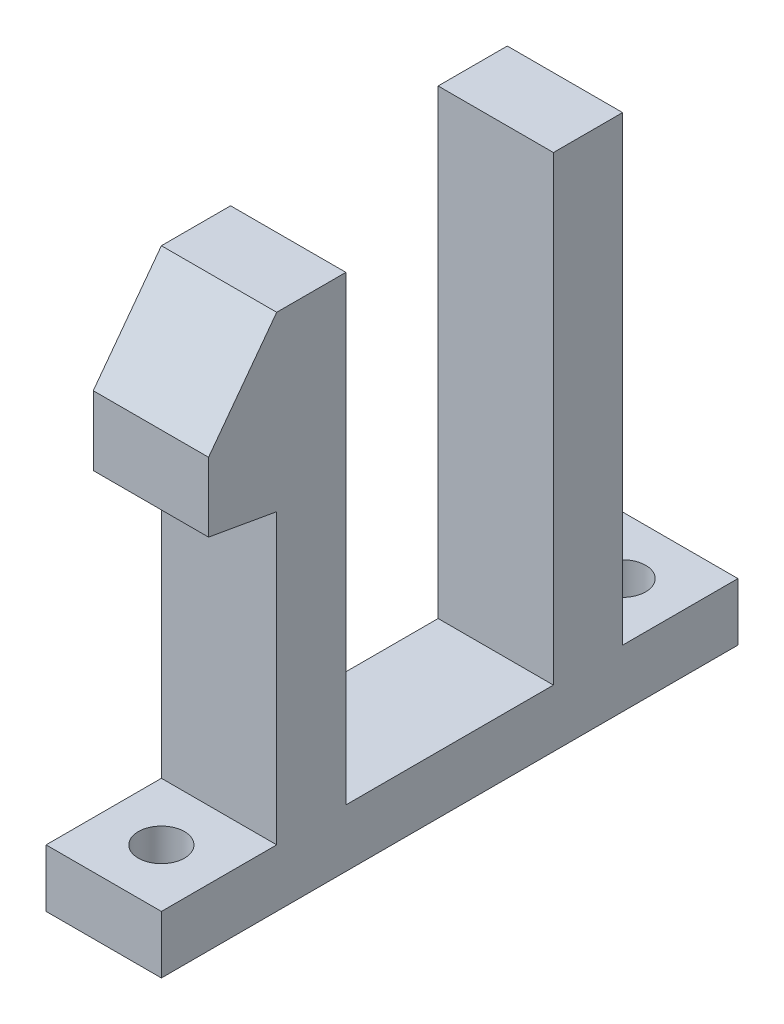
ISO-10303-21;
HEADER;
FILE_DESCRIPTION(('STEP AP214'),'2;1');
FILE_NAME('part.step','',(''),(''),'','','');
FILE_SCHEMA(('AUTOMOTIVE_DESIGN { 1 0 10303 214 1 1 1 1 }'));
ENDSEC;
DATA;
#1=APPLICATION_CONTEXT('core data for automotive mechanical design processes');
#2=APPLICATION_PROTOCOL_DEFINITION('international standard','automotive_design',2000,#1);
#3=PRODUCT_CONTEXT('',#1,'mechanical');
#4=PRODUCT('Part','Part','',(#3));
#5=PRODUCT_RELATED_PRODUCT_CATEGORY('part','',(#4));
#6=PRODUCT_DEFINITION_FORMATION('','',#4);
#7=PRODUCT_DEFINITION_CONTEXT('part definition',#1,'design');
#8=PRODUCT_DEFINITION('design','',#6,#7);
#9=PRODUCT_DEFINITION_SHAPE('','',#8);
#10=(LENGTH_UNIT() NAMED_UNIT(*) SI_UNIT(.MILLI.,.METRE.));
#11=(NAMED_UNIT(*) PLANE_ANGLE_UNIT() SI_UNIT($,.RADIAN.));
#12=(NAMED_UNIT(*) SI_UNIT($,.STERADIAN.) SOLID_ANGLE_UNIT());
#13=UNCERTAINTY_MEASURE_WITH_UNIT(LENGTH_MEASURE(1.E-05),#10,'distance_accuracy_value','');
#14=(GEOMETRIC_REPRESENTATION_CONTEXT(3) GLOBAL_UNCERTAINTY_ASSIGNED_CONTEXT((#13)) GLOBAL_UNIT_ASSIGNED_CONTEXT((#10,
#11,#12)) REPRESENTATION_CONTEXT('',''));
#15=CARTESIAN_POINT('',(0.,0.,0.));
#16=DIRECTION('',(0.,0.,1.));
#17=DIRECTION('',(1.,0.,0.));
#18=AXIS2_PLACEMENT_3D('',#15,#16,#17);
#19=CARTESIAN_POINT('',(0.,22.5,0.));
#20=DIRECTION('',(0.,1.,0.));
#21=DIRECTION('',(0.,0.,1.));
#22=AXIS2_PLACEMENT_3D('',#19,#20,#21);
#23=PLANE('',#22);
#24=DIRECTION('',(1.,0.,0.));
#25=VECTOR('',#24,1.);
#26=CARTESIAN_POINT('',(-2.5,22.5,4.5));
#27=LINE('',#26,#25);
#28=CARTESIAN_POINT('',(-2.5,22.5,4.5));
#29=VERTEX_POINT('',#28);
#30=CARTESIAN_POINT('',(2.5,22.5,4.5));
#31=VERTEX_POINT('',#30);
#32=EDGE_CURVE('E173',#29,#31,#27,.T.);
#33=ORIENTED_EDGE('',*,*,#32,.F.);
#34=DIRECTION('',(0.,0.,1.));
#35=VECTOR('',#34,1.);
#36=CARTESIAN_POINT('',(-2.5,22.5,-7.5));
#37=LINE('',#36,#35);
#38=CARTESIAN_POINT('',(-2.5,22.5,7.5));
#39=VERTEX_POINT('',#38);
#40=EDGE_CURVE('E167',#29,#39,#37,.T.);
#41=ORIENTED_EDGE('',*,*,#40,.T.);
#42=DIRECTION('',(1.,0.,0.));
#43=VECTOR('',#42,1.);
#44=CARTESIAN_POINT('',(-2.5,22.5,7.5));
#45=LINE('',#44,#43);
#46=CARTESIAN_POINT('',(2.5,22.5,7.5));
#47=VERTEX_POINT('',#46);
#48=EDGE_CURVE('E149',#39,#47,#45,.T.);
#49=ORIENTED_EDGE('',*,*,#48,.T.);
#50=DIRECTION('',(0.,0.,-1.));
#51=VECTOR('',#50,1.);
#52=CARTESIAN_POINT('',(2.5,22.5,-7.5));
#53=LINE('',#52,#51);
#54=EDGE_CURVE('E177',#47,#31,#53,.T.);
#55=ORIENTED_EDGE('',*,*,#54,.T.);
#56=EDGE_LOOP('',(#33,#41,#49,#55));
#57=FACE_BOUND('',#56,.T.);
#58=ADVANCED_FACE('F41',(#57),#23,.T.);
#59=CARTESIAN_POINT('',(0.,2.5,0.));
#60=DIRECTION('',(0.,1.,0.));
#61=DIRECTION('',(0.,0.,1.));
#62=AXIS2_PLACEMENT_3D('',#59,#60,#61);
#63=PLANE('',#62);
#64=DIRECTION('',(1.,0.,0.));
#65=VECTOR('',#64,1.);
#66=CARTESIAN_POINT('',(-2.5,2.5,7.5));
#67=LINE('',#66,#65);
#68=CARTESIAN_POINT('',(-2.5,2.5,7.5));
#69=VERTEX_POINT('',#68);
#70=CARTESIAN_POINT('',(2.5,2.5,7.5));
#71=VERTEX_POINT('',#70);
#72=EDGE_CURVE('E184',#69,#71,#67,.T.);
#73=ORIENTED_EDGE('',*,*,#72,.F.);
#74=DIRECTION('',(0.,0.,1.));
#75=VECTOR('',#74,1.);
#76=CARTESIAN_POINT('',(-2.5,2.5,-12.5));
#77=LINE('',#76,#75);
#78=CARTESIAN_POINT('',(-2.5,2.5,12.5));
#79=VERTEX_POINT('',#78);
#80=EDGE_CURVE('E216',#69,#79,#77,.T.);
#81=ORIENTED_EDGE('',*,*,#80,.T.);
#82=DIRECTION('',(1.,0.,0.));
#83=VECTOR('',#82,1.);
#84=CARTESIAN_POINT('',(-2.5,2.5,12.5));
#85=LINE('',#84,#83);
#86=CARTESIAN_POINT('',(2.5,2.5,12.5));
#87=VERTEX_POINT('',#86);
#88=EDGE_CURVE('E219',#79,#87,#85,.T.);
#89=ORIENTED_EDGE('',*,*,#88,.T.);
#90=DIRECTION('',(0.,0.,-1.));
#91=VECTOR('',#90,1.);
#92=CARTESIAN_POINT('',(2.5,2.5,-12.5));
#93=LINE('',#92,#91);
#94=EDGE_CURVE('E210',#87,#71,#93,.T.);
#95=ORIENTED_EDGE('',*,*,#94,.T.);
#96=EDGE_LOOP('',(#73,#81,#89,#95));
#97=FACE_BOUND('',#96,.T.);
#98=CARTESIAN_POINT('',(0.,2.5,10.));
#99=DIRECTION('',(0.,1.,0.));
#100=DIRECTION('',(0.,0.,-1.));
#101=AXIS2_PLACEMENT_3D('',#98,#99,#100);
#102=CIRCLE('',#101,1.);
#103=CARTESIAN_POINT('',(0.,2.5,9.));
#104=VERTEX_POINT('',#103);
#105=EDGE_CURVE('E198',#104,#104,#102,.T.);
#106=ORIENTED_EDGE('',*,*,#105,.F.);
#107=EDGE_LOOP('',(#106));
#108=FACE_BOUND('',#107,.T.);
#109=ADVANCED_FACE('F256',(#97,#108),#63,.T.);
#110=DIRECTION('',(-1.,0.,0.));
#111=VECTOR('',#110,1.);
#112=CARTESIAN_POINT('',(-2.5,2.5,-7.5));
#113=LINE('',#112,#111);
#114=CARTESIAN_POINT('',(2.5,2.5,-7.5));
#115=VERTEX_POINT('',#114);
#116=CARTESIAN_POINT('',(-2.5,2.5,-7.5));
#117=VERTEX_POINT('',#116);
#118=EDGE_CURVE('E181',#115,#117,#113,.T.);
#119=ORIENTED_EDGE('',*,*,#118,.F.);
#120=CARTESIAN_POINT('',(2.5,2.5,-12.5));
#121=VERTEX_POINT('',#120);
#122=EDGE_CURVE('E214',#115,#121,#93,.T.);
#123=ORIENTED_EDGE('',*,*,#122,.T.);
#124=DIRECTION('',(-1.,0.,0.));
#125=VECTOR('',#124,1.);
#126=CARTESIAN_POINT('',(-2.5,2.5,-12.5));
#127=LINE('',#126,#125);
#128=CARTESIAN_POINT('',(-2.5,2.5,-12.5));
#129=VERTEX_POINT('',#128);
#130=EDGE_CURVE('E213',#121,#129,#127,.T.);
#131=ORIENTED_EDGE('',*,*,#130,.T.);
#132=EDGE_CURVE('E217',#129,#117,#77,.T.);
#133=ORIENTED_EDGE('',*,*,#132,.T.);
#134=EDGE_LOOP('',(#119,#123,#131,#133));
#135=FACE_BOUND('',#134,.T.);
#136=CARTESIAN_POINT('',(0.,2.5,-10.));
#137=DIRECTION('',(0.,1.,0.));
#138=DIRECTION('',(0.,0.,1.));
#139=AXIS2_PLACEMENT_3D('',#136,#137,#138);
#140=CIRCLE('',#139,1.);
#141=CARTESIAN_POINT('',(0.,2.5,-9.));
#142=VERTEX_POINT('',#141);
#143=EDGE_CURVE('E204',#142,#142,#140,.T.);
#144=ORIENTED_EDGE('',*,*,#143,.F.);
#145=EDGE_LOOP('',(#144));
#146=FACE_BOUND('',#145,.T.);
#147=ADVANCED_FACE('F310',(#135,#146),#63,.T.);
#148=CARTESIAN_POINT('',(0.,0.,0.));
#149=DIRECTION('',(0.,1.,0.));
#150=DIRECTION('',(0.,0.,1.));
#151=AXIS2_PLACEMENT_3D('',#148,#149,#150);
#152=PLANE('',#151);
#153=DIRECTION('',(0.,0.,-1.));
#154=VECTOR('',#153,1.);
#155=CARTESIAN_POINT('',(2.5,0.,-12.5));
#156=LINE('',#155,#154);
#157=CARTESIAN_POINT('',(2.5,0.,12.5));
#158=VERTEX_POINT('',#157);
#159=CARTESIAN_POINT('',(2.5,0.,-12.5));
#160=VERTEX_POINT('',#159);
#161=EDGE_CURVE('E207',#158,#160,#156,.T.);
#162=ORIENTED_EDGE('',*,*,#161,.F.);
#163=DIRECTION('',(1.,0.,0.));
#164=VECTOR('',#163,1.);
#165=CARTESIAN_POINT('',(-2.5,0.,12.5));
#166=LINE('',#165,#164);
#167=CARTESIAN_POINT('',(-2.5,0.,12.5));
#168=VERTEX_POINT('',#167);
#169=EDGE_CURVE('E228',#168,#158,#166,.T.);
#170=ORIENTED_EDGE('',*,*,#169,.F.);
#171=DIRECTION('',(0.,0.,1.));
#172=VECTOR('',#171,1.);
#173=CARTESIAN_POINT('',(-2.5,0.,-12.5));
#174=LINE('',#173,#172);
#175=CARTESIAN_POINT('',(-2.5,0.,-12.5));
#176=VERTEX_POINT('',#175);
#177=EDGE_CURVE('E226',#176,#168,#174,.T.);
#178=ORIENTED_EDGE('',*,*,#177,.F.);
#179=DIRECTION('',(-1.,0.,0.));
#180=VECTOR('',#179,1.);
#181=CARTESIAN_POINT('',(-2.5,0.,-12.5));
#182=LINE('',#181,#180);
#183=EDGE_CURVE('E224',#160,#176,#182,.T.);
#184=ORIENTED_EDGE('',*,*,#183,.F.);
#185=EDGE_LOOP('',(#162,#170,#178,#184));
#186=FACE_BOUND('',#185,.T.);
#187=CARTESIAN_POINT('',(0.,0.,-10.));
#188=DIRECTION('',(0.,1.,0.));
#189=DIRECTION('',(0.,0.,1.));
#190=AXIS2_PLACEMENT_3D('',#187,#188,#189);
#191=CIRCLE('',#190,1.);
#192=CARTESIAN_POINT('',(0.,0.,-9.));
#193=VERTEX_POINT('',#192);
#194=EDGE_CURVE('E201',#193,#193,#191,.T.);
#195=ORIENTED_EDGE('',*,*,#194,.T.);
#196=EDGE_LOOP('',(#195));
#197=FACE_BOUND('',#196,.T.);
#198=CARTESIAN_POINT('',(0.,0.,10.));
#199=DIRECTION('',(0.,1.,0.));
#200=DIRECTION('',(0.,0.,-1.));
#201=AXIS2_PLACEMENT_3D('',#198,#199,#200);
#202=CIRCLE('',#201,1.);
#203=CARTESIAN_POINT('',(0.,0.,9.));
#204=VERTEX_POINT('',#203);
#205=EDGE_CURVE('E197',#204,#204,#202,.T.);
#206=ORIENTED_EDGE('',*,*,#205,.T.);
#207=EDGE_LOOP('',(#206));
#208=FACE_BOUND('',#207,.T.);
#209=ADVANCED_FACE('F244',(#186,#197,#208),#152,.F.);
#210=CARTESIAN_POINT('',(2.5,2.5,-12.5));
#211=DIRECTION('',(-1.,0.,0.));
#212=DIRECTION('',(0.,0.,1.));
#213=AXIS2_PLACEMENT_3D('',#210,#211,#212);
#214=PLANE('',#213);
#215=DIRECTION('',(0.,0.,-1.));
#216=VECTOR('',#215,1.);
#217=CARTESIAN_POINT('',(2.5,2.49999999999998,4.5));
#218=LINE('',#217,#216);
#219=CARTESIAN_POINT('',(2.5,2.49999999999998,4.5));
#220=VERTEX_POINT('',#219);
#221=CARTESIAN_POINT('',(2.5,2.49999999999998,-4.5));
#222=VERTEX_POINT('',#221);
#223=EDGE_CURVE('E290',#220,#222,#218,.T.);
#224=ORIENTED_EDGE('',*,*,#223,.F.);
#225=DIRECTION('',(0.,-1.,0.));
#226=VECTOR('',#225,1.);
#227=CARTESIAN_POINT('',(2.5,22.5,4.5));
#228=LINE('',#227,#226);
#229=EDGE_CURVE('E277',#31,#220,#228,.T.);
#230=ORIENTED_EDGE('',*,*,#229,.F.);
#231=ORIENTED_EDGE('',*,*,#54,.F.);
#232=DIRECTION('',(0.,-0.802022675244056,0.597293586433312));
#233=VECTOR('',#232,1.);
#234=CARTESIAN_POINT('',(2.5,18.5329149687256,10.4544232590366));
#235=LINE('',#234,#233);
#236=CARTESIAN_POINT('',(2.5,18.5329149687256,10.4544232590366));
#237=VERTEX_POINT('',#236);
#238=EDGE_CURVE('E154',#47,#237,#235,.T.);
#239=ORIENTED_EDGE('',*,*,#238,.T.);
#240=DIRECTION('',(0.,-1.,0.));
#241=VECTOR('',#240,1.);
#242=CARTESIAN_POINT('',(2.5,15.5329149687256,10.4544232590366));
#243=LINE('',#242,#241);
#244=CARTESIAN_POINT('',(2.5,15.5329149687256,10.4544232590366));
#245=VERTEX_POINT('',#244);
#246=EDGE_CURVE('E273',#237,#245,#243,.T.);
#247=ORIENTED_EDGE('',*,*,#246,.T.);
#248=DIRECTION('',(0.,-0.173648177666934,-0.984807753012207));
#249=VECTOR('',#248,1.);
#250=CARTESIAN_POINT('',(2.5,15.0119704357248,7.5));
#251=LINE('',#250,#249);
#252=CARTESIAN_POINT('',(2.5,15.0119704357248,7.5));
#253=VERTEX_POINT('',#252);
#254=EDGE_CURVE('E56',#245,#253,#251,.T.);
#255=ORIENTED_EDGE('',*,*,#254,.T.);
#256=DIRECTION('',(0.,-1.,0.));
#257=VECTOR('',#256,1.);
#258=CARTESIAN_POINT('',(2.5,22.5,7.5));
#259=LINE('',#258,#257);
#260=EDGE_CURVE('E159',#253,#71,#259,.T.);
#261=ORIENTED_EDGE('',*,*,#260,.T.);
#262=ORIENTED_EDGE('',*,*,#94,.F.);
#263=DIRECTION('',(0.,-1.,0.));
#264=VECTOR('',#263,1.);
#265=CARTESIAN_POINT('',(2.5,2.5,12.5));
#266=LINE('',#265,#264);
#267=EDGE_CURVE('E221',#87,#158,#266,.T.);
#268=ORIENTED_EDGE('',*,*,#267,.T.);
#269=ORIENTED_EDGE('',*,*,#161,.T.);
#270=DIRECTION('',(0.,-1.,0.));
#271=VECTOR('',#270,1.);
#272=CARTESIAN_POINT('',(2.5,2.5,-12.5));
#273=LINE('',#272,#271);
#274=EDGE_CURVE('E11',#121,#160,#273,.T.);
#275=ORIENTED_EDGE('',*,*,#274,.F.);
#276=ORIENTED_EDGE('',*,*,#122,.F.);
#277=DIRECTION('',(0.,-1.,0.));
#278=VECTOR('',#277,1.);
#279=CARTESIAN_POINT('',(2.5,22.5,-7.5));
#280=LINE('',#279,#278);
#281=CARTESIAN_POINT('',(2.5,22.5,-7.5));
#282=VERTEX_POINT('',#281);
#283=EDGE_CURVE('E194',#282,#115,#280,.T.);
#284=ORIENTED_EDGE('',*,*,#283,.F.);
#285=CARTESIAN_POINT('',(2.5,22.5,-4.5));
#286=VERTEX_POINT('',#285);
#287=EDGE_CURVE('E187',#286,#282,#53,.T.);
#288=ORIENTED_EDGE('',*,*,#287,.F.);
#289=DIRECTION('',(0.,1.,0.));
#290=VECTOR('',#289,1.);
#291=CARTESIAN_POINT('',(2.5,22.5,-4.5));
#292=LINE('',#291,#290);
#293=EDGE_CURVE('E64',#222,#286,#292,.T.);
#294=ORIENTED_EDGE('',*,*,#293,.F.);
#295=EDGE_LOOP('',(#224,#230,#231,#239,#247,#255,#261,#262,#268,#269,#275,#276,#284,#288,#294));
#296=FACE_BOUND('',#295,.T.);
#297=ADVANCED_FACE('F43',(#296),#214,.F.);
#298=CARTESIAN_POINT('',(-2.5,2.5,-12.5));
#299=DIRECTION('',(0.,0.,1.));
#300=DIRECTION('',(1.,0.,0.));
#301=AXIS2_PLACEMENT_3D('',#298,#299,#300);
#302=PLANE('',#301);
#303=ORIENTED_EDGE('',*,*,#183,.T.);
#304=DIRECTION('',(0.,-1.,0.));
#305=VECTOR('',#304,1.);
#306=CARTESIAN_POINT('',(-2.5,2.5,-12.5));
#307=LINE('',#306,#305);
#308=EDGE_CURVE('E49',#129,#176,#307,.T.);
#309=ORIENTED_EDGE('',*,*,#308,.F.);
#310=ORIENTED_EDGE('',*,*,#130,.F.);
#311=ORIENTED_EDGE('',*,*,#274,.T.);
#312=EDGE_LOOP('',(#303,#309,#310,#311));
#313=FACE_BOUND('',#312,.T.);
#314=ADVANCED_FACE('F312',(#313),#302,.F.);
#315=CARTESIAN_POINT('',(-2.5,2.5,-12.5));
#316=DIRECTION('',(1.,0.,0.));
#317=DIRECTION('',(0.,0.,-1.));
#318=AXIS2_PLACEMENT_3D('',#315,#316,#317);
#319=PLANE('',#318);
#320=ORIENTED_EDGE('',*,*,#40,.F.);
#321=DIRECTION('',(0.,-1.,0.));
#322=VECTOR('',#321,1.);
#323=CARTESIAN_POINT('',(-2.5,22.5,4.5));
#324=LINE('',#323,#322);
#325=CARTESIAN_POINT('',(-2.5,2.49999999999998,4.5));
#326=VERTEX_POINT('',#325);
#327=EDGE_CURVE('E279',#29,#326,#324,.T.);
#328=ORIENTED_EDGE('',*,*,#327,.T.);
#329=DIRECTION('',(0.,0.,-1.));
#330=VECTOR('',#329,1.);
#331=CARTESIAN_POINT('',(-2.5,2.49999999999998,4.5));
#332=LINE('',#331,#330);
#333=CARTESIAN_POINT('',(-2.5,2.49999999999998,-4.5));
#334=VERTEX_POINT('',#333);
#335=EDGE_CURVE('E281',#326,#334,#332,.T.);
#336=ORIENTED_EDGE('',*,*,#335,.T.);
#337=DIRECTION('',(0.,1.,0.));
#338=VECTOR('',#337,1.);
#339=CARTESIAN_POINT('',(-2.5,22.5,-4.5));
#340=LINE('',#339,#338);
#341=CARTESIAN_POINT('',(-2.5,22.5,-4.5));
#342=VERTEX_POINT('',#341);
#343=EDGE_CURVE('E284',#334,#342,#340,.T.);
#344=ORIENTED_EDGE('',*,*,#343,.T.);
#345=CARTESIAN_POINT('',(-2.5,22.5,-7.5));
#346=VERTEX_POINT('',#345);
#347=EDGE_CURVE('E160',#346,#342,#37,.T.);
#348=ORIENTED_EDGE('',*,*,#347,.F.);
#349=DIRECTION('',(0.,-1.,0.));
#350=VECTOR('',#349,1.);
#351=CARTESIAN_POINT('',(-2.5,22.5,-7.5));
#352=LINE('',#351,#350);
#353=EDGE_CURVE('E191',#346,#117,#352,.T.);
#354=ORIENTED_EDGE('',*,*,#353,.T.);
#355=ORIENTED_EDGE('',*,*,#132,.F.);
#356=ORIENTED_EDGE('',*,*,#308,.T.);
#357=ORIENTED_EDGE('',*,*,#177,.T.);
#358=DIRECTION('',(0.,-1.,0.));
#359=VECTOR('',#358,1.);
#360=CARTESIAN_POINT('',(-2.5,2.5,12.5));
#361=LINE('',#360,#359);
#362=EDGE_CURVE('E232',#79,#168,#361,.T.);
#363=ORIENTED_EDGE('',*,*,#362,.F.);
#364=ORIENTED_EDGE('',*,*,#80,.F.);
#365=DIRECTION('',(0.,-1.,0.));
#366=VECTOR('',#365,1.);
#367=CARTESIAN_POINT('',(-2.5,22.5,7.5));
#368=LINE('',#367,#366);
#369=CARTESIAN_POINT('',(-2.5,15.0119704357248,7.5));
#370=VERTEX_POINT('',#369);
#371=EDGE_CURVE('E189',#370,#69,#368,.T.);
#372=ORIENTED_EDGE('',*,*,#371,.F.);
#373=DIRECTION('',(0.,-0.173648177666934,-0.984807753012207));
#374=VECTOR('',#373,1.);
#375=CARTESIAN_POINT('',(-2.5,15.0119704357248,7.5));
#376=LINE('',#375,#374);
#377=CARTESIAN_POINT('',(-2.5,15.5329149687256,10.4544232590366));
#378=VERTEX_POINT('',#377);
#379=EDGE_CURVE('E264',#378,#370,#376,.T.);
#380=ORIENTED_EDGE('',*,*,#379,.F.);
#381=DIRECTION('',(0.,-1.,0.));
#382=VECTOR('',#381,1.);
#383=CARTESIAN_POINT('',(-2.5,15.5329149687256,10.4544232590366));
#384=LINE('',#383,#382);
#385=CARTESIAN_POINT('',(-2.5,18.5329149687256,10.4544232590366));
#386=VERTEX_POINT('',#385);
#387=EDGE_CURVE('E170',#386,#378,#384,.T.);
#388=ORIENTED_EDGE('',*,*,#387,.F.);
#389=DIRECTION('',(0.,-0.802022675244056,0.597293586433312));
#390=VECTOR('',#389,1.);
#391=CARTESIAN_POINT('',(-2.5,18.5329149687256,10.4544232590366));
#392=LINE('',#391,#390);
#393=EDGE_CURVE('E152',#39,#386,#392,.T.);
#394=ORIENTED_EDGE('',*,*,#393,.F.);
#395=EDGE_LOOP('',(#320,#328,#336,#344,#348,#354,#355,#356,#357,#363,#364,#372,#380,#388,#394));
#396=FACE_BOUND('',#395,.T.);
#397=ADVANCED_FACE('F165',(#396),#319,.F.);
#398=CARTESIAN_POINT('',(-2.5,2.5,12.5));
#399=DIRECTION('',(0.,0.,-1.));
#400=DIRECTION('',(-1.,0.,0.));
#401=AXIS2_PLACEMENT_3D('',#398,#399,#400);
#402=PLANE('',#401);
#403=ORIENTED_EDGE('',*,*,#169,.T.);
#404=ORIENTED_EDGE('',*,*,#267,.F.);
#405=ORIENTED_EDGE('',*,*,#88,.F.);
#406=ORIENTED_EDGE('',*,*,#362,.T.);
#407=EDGE_LOOP('',(#403,#404,#405,#406));
#408=FACE_BOUND('',#407,.T.);
#409=ADVANCED_FACE('F248',(#408),#402,.F.);
#410=CARTESIAN_POINT('',(0.,2.5,-10.));
#411=DIRECTION('',(0.,-1.,0.));
#412=DIRECTION('',(0.,0.,-1.));
#413=AXIS2_PLACEMENT_3D('',#410,#411,#412);
#414=CYLINDRICAL_SURFACE('',#413,1.);
#415=ORIENTED_EDGE('',*,*,#143,.T.);
#416=EDGE_LOOP('',(#415));
#417=FACE_BOUND('',#416,.T.);
#418=ORIENTED_EDGE('',*,*,#194,.F.);
#419=EDGE_LOOP('',(#418));
#420=FACE_BOUND('',#419,.T.);
#421=ADVANCED_FACE('F347',(#417,#420),#414,.F.);
#422=CARTESIAN_POINT('',(0.,2.5,10.));
#423=DIRECTION('',(0.,-1.,0.));
#424=DIRECTION('',(0.,0.,-1.));
#425=AXIS2_PLACEMENT_3D('',#422,#423,#424);
#426=CYLINDRICAL_SURFACE('',#425,1.);
#427=ORIENTED_EDGE('',*,*,#105,.T.);
#428=EDGE_LOOP('',(#427));
#429=FACE_BOUND('',#428,.T.);
#430=ORIENTED_EDGE('',*,*,#205,.F.);
#431=EDGE_LOOP('',(#430));
#432=FACE_BOUND('',#431,.T.);
#433=ADVANCED_FACE('F342',(#429,#432),#426,.F.);
#434=CARTESIAN_POINT('',(-2.5,22.5,-7.5));
#435=DIRECTION('',(0.,0.,1.));
#436=DIRECTION('',(1.,0.,0.));
#437=AXIS2_PLACEMENT_3D('',#434,#435,#436);
#438=PLANE('',#437);
#439=ORIENTED_EDGE('',*,*,#118,.T.);
#440=ORIENTED_EDGE('',*,*,#353,.F.);
#441=DIRECTION('',(-1.,0.,0.));
#442=VECTOR('',#441,1.);
#443=CARTESIAN_POINT('',(-2.5,22.5,-7.5));
#444=LINE('',#443,#442);
#445=EDGE_CURVE('E174',#282,#346,#444,.T.);
#446=ORIENTED_EDGE('',*,*,#445,.F.);
#447=ORIENTED_EDGE('',*,*,#283,.T.);
#448=EDGE_LOOP('',(#439,#440,#446,#447));
#449=FACE_BOUND('',#448,.T.);
#450=ADVANCED_FACE('F306',(#449),#438,.F.);
#451=CARTESIAN_POINT('',(-2.5,22.5,7.5));
#452=DIRECTION('',(0.,0.,-1.));
#453=DIRECTION('',(-1.,0.,0.));
#454=AXIS2_PLACEMENT_3D('',#451,#452,#453);
#455=PLANE('',#454);
#456=ORIENTED_EDGE('',*,*,#260,.F.);
#457=DIRECTION('',(1.,0.,0.));
#458=VECTOR('',#457,1.);
#459=CARTESIAN_POINT('',(-2.5,15.0119704357248,7.5));
#460=LINE('',#459,#458);
#461=EDGE_CURVE('E263',#370,#253,#460,.T.);
#462=ORIENTED_EDGE('',*,*,#461,.F.);
#463=ORIENTED_EDGE('',*,*,#371,.T.);
#464=ORIENTED_EDGE('',*,*,#72,.T.);
#465=EDGE_LOOP('',(#456,#462,#463,#464));
#466=FACE_BOUND('',#465,.T.);
#467=ADVANCED_FACE('F260',(#466),#455,.F.);
#468=DIRECTION('',(1.,0.,0.));
#469=VECTOR('',#468,1.);
#470=CARTESIAN_POINT('',(-2.5,22.5,-4.5));
#471=LINE('',#470,#469);
#472=EDGE_CURVE('E295',#342,#286,#471,.T.);
#473=ORIENTED_EDGE('',*,*,#472,.T.);
#474=ORIENTED_EDGE('',*,*,#287,.T.);
#475=ORIENTED_EDGE('',*,*,#445,.T.);
#476=ORIENTED_EDGE('',*,*,#347,.T.);
#477=EDGE_LOOP('',(#473,#474,#475,#476));
#478=FACE_BOUND('',#477,.T.);
#479=ADVANCED_FACE('F302',(#478),#23,.T.);
#480=CARTESIAN_POINT('',(-2.5,22.5,4.5));
#481=DIRECTION('',(0.,0.,1.));
#482=DIRECTION('',(1.,0.,0.));
#483=AXIS2_PLACEMENT_3D('',#480,#481,#482);
#484=PLANE('',#483);
#485=ORIENTED_EDGE('',*,*,#229,.T.);
#486=DIRECTION('',(1.,0.,0.));
#487=VECTOR('',#486,1.);
#488=CARTESIAN_POINT('',(-2.5,2.49999999999998,4.5));
#489=LINE('',#488,#487);
#490=EDGE_CURVE('E287',#326,#220,#489,.T.);
#491=ORIENTED_EDGE('',*,*,#490,.F.);
#492=ORIENTED_EDGE('',*,*,#327,.F.);
#493=ORIENTED_EDGE('',*,*,#32,.T.);
#494=EDGE_LOOP('',(#485,#491,#492,#493));
#495=FACE_BOUND('',#494,.T.);
#496=ADVANCED_FACE('F331',(#495),#484,.F.);
#497=CARTESIAN_POINT('',(-2.5,22.5,-4.5));
#498=DIRECTION('',(0.,0.,-1.));
#499=DIRECTION('',(-1.,0.,0.));
#500=AXIS2_PLACEMENT_3D('',#497,#498,#499);
#501=PLANE('',#500);
#502=ORIENTED_EDGE('',*,*,#293,.T.);
#503=ORIENTED_EDGE('',*,*,#472,.F.);
#504=ORIENTED_EDGE('',*,*,#343,.F.);
#505=DIRECTION('',(1.,0.,0.));
#506=VECTOR('',#505,1.);
#507=CARTESIAN_POINT('',(-2.5,2.49999999999998,-4.5));
#508=LINE('',#507,#506);
#509=EDGE_CURVE('E297',#334,#222,#508,.T.);
#510=ORIENTED_EDGE('',*,*,#509,.T.);
#511=EDGE_LOOP('',(#502,#503,#504,#510));
#512=FACE_BOUND('',#511,.T.);
#513=ADVANCED_FACE('F336',(#512),#501,.F.);
#514=CARTESIAN_POINT('',(-2.5,2.49999999999998,4.5));
#515=DIRECTION('',(0.,-1.,0.));
#516=DIRECTION('',(0.,0.,-1.));
#517=AXIS2_PLACEMENT_3D('',#514,#515,#516);
#518=PLANE('',#517);
#519=ORIENTED_EDGE('',*,*,#223,.T.);
#520=ORIENTED_EDGE('',*,*,#509,.F.);
#521=ORIENTED_EDGE('',*,*,#335,.F.);
#522=ORIENTED_EDGE('',*,*,#490,.T.);
#523=EDGE_LOOP('',(#519,#520,#521,#522));
#524=FACE_BOUND('',#523,.T.);
#525=ADVANCED_FACE('F415',(#524),#518,.F.);
#526=CARTESIAN_POINT('',(-2.5,15.0119704357248,7.5));
#527=DIRECTION('',(0.,-0.984807753012207,0.173648177666934));
#528=DIRECTION('',(0.,-0.173648177666934,-0.984807753012207));
#529=AXIS2_PLACEMENT_3D('',#526,#527,#528);
#530=PLANE('',#529);
#531=ORIENTED_EDGE('',*,*,#254,.F.);
#532=DIRECTION('',(1.,0.,0.));
#533=VECTOR('',#532,1.);
#534=CARTESIAN_POINT('',(-2.5,15.5329149687256,10.4544232590366));
#535=LINE('',#534,#533);
#536=EDGE_CURVE('E268',#378,#245,#535,.T.);
#537=ORIENTED_EDGE('',*,*,#536,.F.);
#538=ORIENTED_EDGE('',*,*,#379,.T.);
#539=ORIENTED_EDGE('',*,*,#461,.T.);
#540=EDGE_LOOP('',(#531,#537,#538,#539));
#541=FACE_BOUND('',#540,.T.);
#542=ADVANCED_FACE('F423',(#541),#530,.T.);
#543=CARTESIAN_POINT('',(-2.5,15.5329149687256,10.4544232590366));
#544=DIRECTION('',(0.,0.,1.));
#545=DIRECTION('',(0.,-1.,0.));
#546=AXIS2_PLACEMENT_3D('',#543,#544,#545);
#547=PLANE('',#546);
#548=ORIENTED_EDGE('',*,*,#246,.F.);
#549=DIRECTION('',(1.,0.,0.));
#550=VECTOR('',#549,1.);
#551=CARTESIAN_POINT('',(-2.5,18.5329149687256,10.4544232590366));
#552=LINE('',#551,#550);
#553=EDGE_CURVE('E266',#386,#237,#552,.T.);
#554=ORIENTED_EDGE('',*,*,#553,.F.);
#555=ORIENTED_EDGE('',*,*,#387,.T.);
#556=ORIENTED_EDGE('',*,*,#536,.T.);
#557=EDGE_LOOP('',(#548,#554,#555,#556));
#558=FACE_BOUND('',#557,.T.);
#559=ADVANCED_FACE('F442',(#558),#547,.T.);
#560=CARTESIAN_POINT('',(-2.5,18.5329149687256,10.4544232590366));
#561=DIRECTION('',(0.,0.597293586433312,0.802022675244056));
#562=DIRECTION('',(0.,-0.802022675244056,0.597293586433312));
#563=AXIS2_PLACEMENT_3D('',#560,#561,#562);
#564=PLANE('',#563);
#565=ORIENTED_EDGE('',*,*,#238,.F.);
#566=ORIENTED_EDGE('',*,*,#48,.F.);
#567=ORIENTED_EDGE('',*,*,#393,.T.);
#568=ORIENTED_EDGE('',*,*,#553,.T.);
#569=EDGE_LOOP('',(#565,#566,#567,#568));
#570=FACE_BOUND('',#569,.T.);
#571=ADVANCED_FACE('F151',(#570),#564,.T.);
#572=CLOSED_SHELL('',(#58,#109,#147,#209,#297,#314,#397,#409,#421,#433,#450,#467,#479,#496,#513,
#525,#542,#559,#571));
#573=MANIFOLD_SOLID_BREP('B2',#572);
#574=ADVANCED_BREP_SHAPE_REPRESENTATION('',(#18,#573),#14);
#575=SHAPE_DEFINITION_REPRESENTATION(#9,#574);
ENDSEC;
END-ISO-10303-21;
